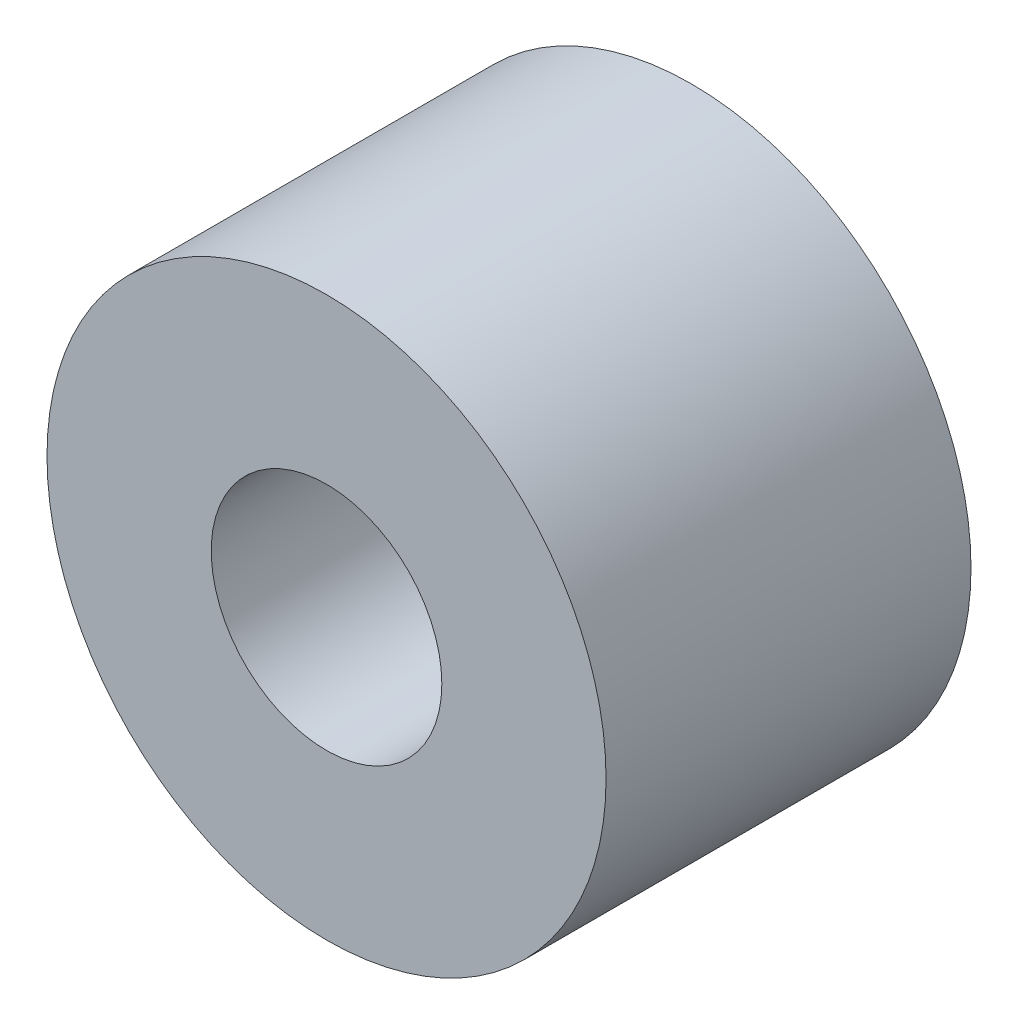
ISO-10303-21;
HEADER;
FILE_DESCRIPTION(('STEP AP214'),'2;1');
FILE_NAME('part.step','',(''),(''),'','','');
FILE_SCHEMA(('AUTOMOTIVE_DESIGN { 1 0 10303 214 1 1 1 1 }'));
ENDSEC;
DATA;
#1=APPLICATION_CONTEXT('core data for automotive mechanical design processes');
#2=APPLICATION_PROTOCOL_DEFINITION('international standard','automotive_design',2000,#1);
#3=PRODUCT_CONTEXT('',#1,'mechanical');
#4=PRODUCT('Part','Part','',(#3));
#5=PRODUCT_RELATED_PRODUCT_CATEGORY('part','',(#4));
#6=PRODUCT_DEFINITION_FORMATION('','',#4);
#7=PRODUCT_DEFINITION_CONTEXT('part definition',#1,'design');
#8=PRODUCT_DEFINITION('design','',#6,#7);
#9=PRODUCT_DEFINITION_SHAPE('','',#8);
#10=(LENGTH_UNIT() NAMED_UNIT(*) SI_UNIT(.MILLI.,.METRE.));
#11=(NAMED_UNIT(*) PLANE_ANGLE_UNIT() SI_UNIT($,.RADIAN.));
#12=(NAMED_UNIT(*) SI_UNIT($,.STERADIAN.) SOLID_ANGLE_UNIT());
#13=UNCERTAINTY_MEASURE_WITH_UNIT(LENGTH_MEASURE(1.E-05),#10,'distance_accuracy_value','');
#14=(GEOMETRIC_REPRESENTATION_CONTEXT(3) GLOBAL_UNCERTAINTY_ASSIGNED_CONTEXT((#13)) GLOBAL_UNIT_ASSIGNED_CONTEXT((#10,
#11,#12)) REPRESENTATION_CONTEXT('',''));
#15=CARTESIAN_POINT('',(0.,0.,0.));
#16=DIRECTION('',(0.,0.,1.));
#17=DIRECTION('',(1.,0.,0.));
#18=AXIS2_PLACEMENT_3D('',#15,#16,#17);
#19=CARTESIAN_POINT('',(0.,0.,0.));
#20=DIRECTION('',(0.,0.,1.));
#21=DIRECTION('',(1.,0.,0.));
#22=AXIS2_PLACEMENT_3D('',#19,#20,#21);
#23=PLANE('',#22);
#24=CARTESIAN_POINT('',(0.,0.,0.));
#25=DIRECTION('',(0.,0.,1.));
#26=DIRECTION('',(1.,0.,0.));
#27=AXIS2_PLACEMENT_3D('',#24,#25,#26);
#28=CIRCLE('',#27,2.25);
#29=CARTESIAN_POINT('',(2.25,0.,0.));
#30=VERTEX_POINT('',#29);
#31=EDGE_CURVE('E47',#30,#30,#28,.T.);
#32=ORIENTED_EDGE('',*,*,#31,.F.);
#33=EDGE_LOOP('',(#32));
#34=FACE_BOUND('',#33,.T.);
#35=CARTESIAN_POINT('',(0.,0.,0.));
#36=DIRECTION('',(0.,0.,1.));
#37=DIRECTION('',(1.,0.,0.));
#38=AXIS2_PLACEMENT_3D('',#35,#36,#37);
#39=CIRCLE('',#38,1.65);
#40=CARTESIAN_POINT('',(1.65,0.,0.));
#41=VERTEX_POINT('',#40);
#42=EDGE_CURVE('E52',#41,#41,#39,.T.);
#43=ORIENTED_EDGE('',*,*,#42,.T.);
#44=EDGE_LOOP('',(#43));
#45=FACE_BOUND('',#44,.T.);
#46=ADVANCED_FACE('F38',(#34,#45),#23,.F.);
#47=CARTESIAN_POINT('',(0.,0.,1.));
#48=DIRECTION('',(0.,0.,-1.));
#49=DIRECTION('',(-1.,0.,0.));
#50=AXIS2_PLACEMENT_3D('',#47,#48,#49);
#51=CYLINDRICAL_SURFACE('',#50,1.65);
#52=ORIENTED_EDGE('',*,*,#42,.F.);
#53=EDGE_LOOP('',(#52));
#54=FACE_BOUND('',#53,.T.);
#55=CARTESIAN_POINT('',(0.,0.,6.));
#56=DIRECTION('',(0.,0.,1.));
#57=DIRECTION('',(1.,0.,0.));
#58=AXIS2_PLACEMENT_3D('',#55,#56,#57);
#59=CIRCLE('',#58,1.65);
#60=CARTESIAN_POINT('',(1.65,0.,6.));
#61=VERTEX_POINT('',#60);
#62=EDGE_CURVE('E63',#61,#61,#59,.T.);
#63=ORIENTED_EDGE('',*,*,#62,.T.);
#64=EDGE_LOOP('',(#63));
#65=FACE_BOUND('',#64,.T.);
#66=ADVANCED_FACE('F68',(#54,#65),#51,.F.);
#67=CARTESIAN_POINT('',(0.,0.,6.));
#68=DIRECTION('',(0.,0.,1.));
#69=DIRECTION('',(1.,0.,0.));
#70=AXIS2_PLACEMENT_3D('',#67,#68,#69);
#71=PLANE('',#70);
#72=CARTESIAN_POINT('',(0.,0.,6.));
#73=DIRECTION('',(0.,0.,1.));
#74=DIRECTION('',(1.,0.,0.));
#75=AXIS2_PLACEMENT_3D('',#72,#73,#74);
#76=CIRCLE('',#75,4.);
#77=CARTESIAN_POINT('',(4.,0.,6.));
#78=VERTEX_POINT('',#77);
#79=EDGE_CURVE('E57',#78,#78,#76,.T.);
#80=ORIENTED_EDGE('',*,*,#79,.T.);
#81=EDGE_LOOP('',(#80));
#82=FACE_BOUND('',#81,.T.);
#83=ORIENTED_EDGE('',*,*,#62,.F.);
#84=EDGE_LOOP('',(#83));
#85=FACE_BOUND('',#84,.T.);
#86=ADVANCED_FACE('F70',(#82,#85),#71,.T.);
#87=CARTESIAN_POINT('',(0.,0.,6.));
#88=DIRECTION('',(0.,0.,-1.));
#89=DIRECTION('',(-1.,0.,0.));
#90=AXIS2_PLACEMENT_3D('',#87,#88,#89);
#91=CYLINDRICAL_SURFACE('',#90,4.);
#92=CARTESIAN_POINT('',(0.,0.,0.777777777777772));
#93=DIRECTION('',(0.,0.,1.));
#94=DIRECTION('',(1.,0.,0.));
#95=AXIS2_PLACEMENT_3D('',#92,#93,#94);
#96=CIRCLE('',#95,4.);
#97=CARTESIAN_POINT('',(4.,0.,0.777777777777772));
#98=VERTEX_POINT('',#97);
#99=EDGE_CURVE('E10',#98,#98,#96,.T.);
#100=ORIENTED_EDGE('',*,*,#99,.T.);
#101=EDGE_LOOP('',(#100));
#102=FACE_BOUND('',#101,.T.);
#103=ORIENTED_EDGE('',*,*,#79,.F.);
#104=EDGE_LOOP('',(#103));
#105=FACE_BOUND('',#104,.T.);
#106=ADVANCED_FACE('F72',(#102,#105),#91,.T.);
#107=CARTESIAN_POINT('',(0.,0.,1.));
#108=DIRECTION('',(0.,0.,1.));
#109=DIRECTION('',(1.,0.,0.));
#110=AXIS2_PLACEMENT_3D('',#107,#108,#109);
#111=CONICAL_SURFACE('',#110,4.50000000000001,1.15257199721566);
#112=ORIENTED_EDGE('',*,*,#31,.T.);
#113=EDGE_LOOP('',(#112));
#114=FACE_BOUND('',#113,.T.);
#115=ORIENTED_EDGE('',*,*,#99,.F.);
#116=EDGE_LOOP('',(#115));
#117=FACE_BOUND('',#116,.T.);
#118=ADVANCED_FACE('F41',(#114,#117),#111,.T.);
#119=CLOSED_SHELL('',(#46,#66,#86,#106,#118));
#120=MANIFOLD_SOLID_BREP('B2',#119);
#121=ADVANCED_BREP_SHAPE_REPRESENTATION('',(#18,#120),#14);
#122=SHAPE_DEFINITION_REPRESENTATION(#9,#121);
ENDSEC;
END-ISO-10303-21;
